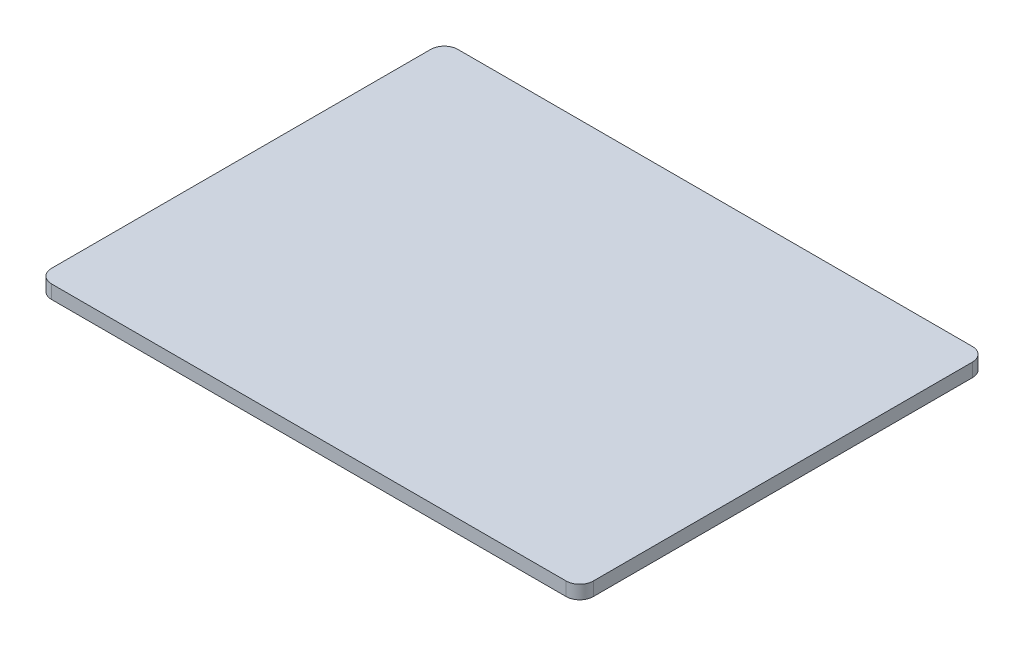
ISO-10303-21;
HEADER;
FILE_DESCRIPTION(('STEP AP214'),'2;1');
FILE_NAME('part.step','',(''),(''),'','','');
FILE_SCHEMA(('AUTOMOTIVE_DESIGN { 1 0 10303 214 1 1 1 1 }'));
ENDSEC;
DATA;
#1=APPLICATION_CONTEXT('core data for automotive mechanical design processes');
#2=APPLICATION_PROTOCOL_DEFINITION('international standard','automotive_design',2000,#1);
#3=PRODUCT_CONTEXT('',#1,'mechanical');
#4=PRODUCT('Part','Part','',(#3));
#5=PRODUCT_RELATED_PRODUCT_CATEGORY('part','',(#4));
#6=PRODUCT_DEFINITION_FORMATION('','',#4);
#7=PRODUCT_DEFINITION_CONTEXT('part definition',#1,'design');
#8=PRODUCT_DEFINITION('design','',#6,#7);
#9=PRODUCT_DEFINITION_SHAPE('','',#8);
#10=(LENGTH_UNIT() NAMED_UNIT(*) SI_UNIT(.MILLI.,.METRE.));
#11=(NAMED_UNIT(*) PLANE_ANGLE_UNIT() SI_UNIT($,.RADIAN.));
#12=(NAMED_UNIT(*) SI_UNIT($,.STERADIAN.) SOLID_ANGLE_UNIT());
#13=UNCERTAINTY_MEASURE_WITH_UNIT(LENGTH_MEASURE(1.E-05),#10,'distance_accuracy_value','');
#14=(GEOMETRIC_REPRESENTATION_CONTEXT(3) GLOBAL_UNCERTAINTY_ASSIGNED_CONTEXT((#13)) GLOBAL_UNIT_ASSIGNED_CONTEXT((#10,
#11,#12)) REPRESENTATION_CONTEXT('',''));
#15=CARTESIAN_POINT('',(0.,0.,0.));
#16=DIRECTION('',(0.,0.,1.));
#17=DIRECTION('',(1.,0.,0.));
#18=AXIS2_PLACEMENT_3D('',#15,#16,#17);
#19=CARTESIAN_POINT('',(0.,10.,0.));
#20=DIRECTION('',(1.,0.,0.));
#21=DIRECTION('',(0.,0.,-1.));
#22=AXIS2_PLACEMENT_3D('',#19,#20,#21);
#23=PLANE('',#22);
#24=DIRECTION('',(0.,0.,1.));
#25=VECTOR('',#24,1.);
#26=CARTESIAN_POINT('',(0.,10.,0.));
#27=LINE('',#26,#25);
#28=CARTESIAN_POINT('',(0.,10.,-290.));
#29=VERTEX_POINT('',#28);
#30=CARTESIAN_POINT('',(0.,10.,-10.));
#31=VERTEX_POINT('',#30);
#32=EDGE_CURVE('E123',#29,#31,#27,.T.);
#33=ORIENTED_EDGE('',*,*,#32,.F.);
#34=DIRECTION('',(0.,-1.,0.));
#35=VECTOR('',#34,1.);
#36=CARTESIAN_POINT('',(0.,10.,-290.));
#37=LINE('',#36,#35);
#38=CARTESIAN_POINT('',(0.,0.,-290.));
#39=VERTEX_POINT('',#38);
#40=EDGE_CURVE('E108',#29,#39,#37,.T.);
#41=ORIENTED_EDGE('',*,*,#40,.T.);
#42=DIRECTION('',(0.,0.,1.));
#43=VECTOR('',#42,1.);
#44=CARTESIAN_POINT('',(0.,0.,0.));
#45=LINE('',#44,#43);
#46=CARTESIAN_POINT('',(0.,0.,-10.));
#47=VERTEX_POINT('',#46);
#48=EDGE_CURVE('E120',#39,#47,#45,.T.);
#49=ORIENTED_EDGE('',*,*,#48,.T.);
#50=DIRECTION('',(0.,-1.,0.));
#51=VECTOR('',#50,1.);
#52=CARTESIAN_POINT('',(0.,10.,-10.));
#53=LINE('',#52,#51);
#54=EDGE_CURVE('E125',#47,#31,#53,.F.);
#55=ORIENTED_EDGE('',*,*,#54,.T.);
#56=EDGE_LOOP('',(#33,#41,#49,#55));
#57=FACE_BOUND('',#56,.T.);
#58=ADVANCED_FACE('F37',(#57),#23,.F.);
#59=CARTESIAN_POINT('',(0.,10.,0.));
#60=DIRECTION('',(0.,0.,-1.));
#61=DIRECTION('',(-1.,0.,0.));
#62=AXIS2_PLACEMENT_3D('',#59,#60,#61);
#63=PLANE('',#62);
#64=DIRECTION('',(1.,0.,0.));
#65=VECTOR('',#64,1.);
#66=CARTESIAN_POINT('',(0.,10.,0.));
#67=LINE('',#66,#65);
#68=CARTESIAN_POINT('',(10.,10.,0.));
#69=VERTEX_POINT('',#68);
#70=CARTESIAN_POINT('',(390.,10.,0.));
#71=VERTEX_POINT('',#70);
#72=EDGE_CURVE('E163',#69,#71,#67,.T.);
#73=ORIENTED_EDGE('',*,*,#72,.F.);
#74=DIRECTION('',(0.,-1.,0.));
#75=VECTOR('',#74,1.);
#76=CARTESIAN_POINT('',(10.,10.,0.));
#77=LINE('',#76,#75);
#78=CARTESIAN_POINT('',(10.,0.,0.));
#79=VERTEX_POINT('',#78);
#80=EDGE_CURVE('E11',#69,#79,#77,.T.);
#81=ORIENTED_EDGE('',*,*,#80,.T.);
#82=DIRECTION('',(1.,0.,0.));
#83=VECTOR('',#82,1.);
#84=CARTESIAN_POINT('',(0.,0.,0.));
#85=LINE('',#84,#83);
#86=CARTESIAN_POINT('',(390.,0.,0.));
#87=VERTEX_POINT('',#86);
#88=EDGE_CURVE('E130',#79,#87,#85,.T.);
#89=ORIENTED_EDGE('',*,*,#88,.T.);
#90=DIRECTION('',(0.,-1.,0.));
#91=VECTOR('',#90,1.);
#92=CARTESIAN_POINT('',(390.,10.,0.));
#93=LINE('',#92,#91);
#94=EDGE_CURVE('E45',#87,#71,#93,.F.);
#95=ORIENTED_EDGE('',*,*,#94,.T.);
#96=EDGE_LOOP('',(#73,#81,#89,#95));
#97=FACE_BOUND('',#96,.T.);
#98=ADVANCED_FACE('F162',(#97),#63,.F.);
#99=CARTESIAN_POINT('',(400.,10.,0.));
#100=DIRECTION('',(-1.,0.,0.));
#101=DIRECTION('',(0.,0.,1.));
#102=AXIS2_PLACEMENT_3D('',#99,#100,#101);
#103=PLANE('',#102);
#104=DIRECTION('',(0.,0.,-1.));
#105=VECTOR('',#104,1.);
#106=CARTESIAN_POINT('',(400.,0.,0.));
#107=LINE('',#106,#105);
#108=CARTESIAN_POINT('',(400.,0.,-10.));
#109=VERTEX_POINT('',#108);
#110=CARTESIAN_POINT('',(400.,0.,-290.));
#111=VERTEX_POINT('',#110);
#112=EDGE_CURVE('E133',#109,#111,#107,.T.);
#113=ORIENTED_EDGE('',*,*,#112,.T.);
#114=DIRECTION('',(0.,-1.,0.));
#115=VECTOR('',#114,1.);
#116=CARTESIAN_POINT('',(400.,10.,-290.));
#117=LINE('',#116,#115);
#118=CARTESIAN_POINT('',(400.,10.,-290.));
#119=VERTEX_POINT('',#118);
#120=EDGE_CURVE('E52',#111,#119,#117,.F.);
#121=ORIENTED_EDGE('',*,*,#120,.T.);
#122=DIRECTION('',(0.,0.,-1.));
#123=VECTOR('',#122,1.);
#124=CARTESIAN_POINT('',(400.,10.,0.));
#125=LINE('',#124,#123);
#126=CARTESIAN_POINT('',(400.,10.,-10.));
#127=VERTEX_POINT('',#126);
#128=EDGE_CURVE('E169',#127,#119,#125,.T.);
#129=ORIENTED_EDGE('',*,*,#128,.F.);
#130=DIRECTION('',(0.,-1.,0.));
#131=VECTOR('',#130,1.);
#132=CARTESIAN_POINT('',(400.,10.,-10.));
#133=LINE('',#132,#131);
#134=EDGE_CURVE('E156',#127,#109,#133,.T.);
#135=ORIENTED_EDGE('',*,*,#134,.T.);
#136=EDGE_LOOP('',(#113,#121,#129,#135));
#137=FACE_BOUND('',#136,.T.);
#138=ADVANCED_FACE('F173',(#137),#103,.F.);
#139=CARTESIAN_POINT('',(0.,10.,-300.));
#140=DIRECTION('',(0.,0.,1.));
#141=DIRECTION('',(1.,0.,0.));
#142=AXIS2_PLACEMENT_3D('',#139,#140,#141);
#143=PLANE('',#142);
#144=DIRECTION('',(-1.,0.,0.));
#145=VECTOR('',#144,1.);
#146=CARTESIAN_POINT('',(0.,0.,-300.));
#147=LINE('',#146,#145);
#148=CARTESIAN_POINT('',(390.,0.,-300.));
#149=VERTEX_POINT('',#148);
#150=CARTESIAN_POINT('',(10.,0.,-300.));
#151=VERTEX_POINT('',#150);
#152=EDGE_CURVE('E140',#149,#151,#147,.T.);
#153=ORIENTED_EDGE('',*,*,#152,.T.);
#154=DIRECTION('',(0.,-1.,0.));
#155=VECTOR('',#154,1.);
#156=CARTESIAN_POINT('',(10.,10.,-300.));
#157=LINE('',#156,#155);
#158=CARTESIAN_POINT('',(10.,10.,-300.));
#159=VERTEX_POINT('',#158);
#160=EDGE_CURVE('E109',#151,#159,#157,.F.);
#161=ORIENTED_EDGE('',*,*,#160,.T.);
#162=DIRECTION('',(-1.,0.,0.));
#163=VECTOR('',#162,1.);
#164=CARTESIAN_POINT('',(0.,10.,-300.));
#165=LINE('',#164,#163);
#166=CARTESIAN_POINT('',(390.,10.,-300.));
#167=VERTEX_POINT('',#166);
#168=EDGE_CURVE('E136',#167,#159,#165,.T.);
#169=ORIENTED_EDGE('',*,*,#168,.F.);
#170=DIRECTION('',(0.,-1.,0.));
#171=VECTOR('',#170,1.);
#172=CARTESIAN_POINT('',(390.,10.,-300.));
#173=LINE('',#172,#171);
#174=EDGE_CURVE('E114',#167,#149,#173,.T.);
#175=ORIENTED_EDGE('',*,*,#174,.T.);
#176=EDGE_LOOP('',(#153,#161,#169,#175));
#177=FACE_BOUND('',#176,.T.);
#178=ADVANCED_FACE('F180',(#177),#143,.F.);
#179=CARTESIAN_POINT('',(0.,10.,0.));
#180=DIRECTION('',(0.,-1.,0.));
#181=DIRECTION('',(0.,0.,-1.));
#182=AXIS2_PLACEMENT_3D('',#179,#180,#181);
#183=PLANE('',#182);
#184=ORIENTED_EDGE('',*,*,#168,.T.);
#185=CARTESIAN_POINT('',(10.,10.,-290.));
#186=DIRECTION('',(0.,-1.,0.));
#187=DIRECTION('',(0.,0.,-1.));
#188=AXIS2_PLACEMENT_3D('',#185,#186,#187);
#189=CIRCLE('',#188,10.);
#190=EDGE_CURVE('E154',#159,#29,#189,.F.);
#191=ORIENTED_EDGE('',*,*,#190,.T.);
#192=ORIENTED_EDGE('',*,*,#32,.T.);
#193=CARTESIAN_POINT('',(10.,10.,-10.));
#194=DIRECTION('',(0.,-1.,0.));
#195=DIRECTION('',(0.,0.,-1.));
#196=AXIS2_PLACEMENT_3D('',#193,#194,#195);
#197=CIRCLE('',#196,10.);
#198=EDGE_CURVE('E150',#31,#69,#197,.F.);
#199=ORIENTED_EDGE('',*,*,#198,.T.);
#200=ORIENTED_EDGE('',*,*,#72,.T.);
#201=CARTESIAN_POINT('',(390.,10.,-10.));
#202=DIRECTION('',(0.,-1.,0.));
#203=DIRECTION('',(0.,0.,-1.));
#204=AXIS2_PLACEMENT_3D('',#201,#202,#203);
#205=CIRCLE('',#204,10.);
#206=EDGE_CURVE('E59',#71,#127,#205,.F.);
#207=ORIENTED_EDGE('',*,*,#206,.T.);
#208=ORIENTED_EDGE('',*,*,#128,.T.);
#209=CARTESIAN_POINT('',(390.,10.,-290.));
#210=DIRECTION('',(0.,-1.,0.));
#211=DIRECTION('',(0.,0.,-1.));
#212=AXIS2_PLACEMENT_3D('',#209,#210,#211);
#213=CIRCLE('',#212,10.);
#214=EDGE_CURVE('E152',#119,#167,#213,.F.);
#215=ORIENTED_EDGE('',*,*,#214,.T.);
#216=EDGE_LOOP('',(#184,#191,#192,#199,#200,#207,#208,#215));
#217=FACE_BOUND('',#216,.T.);
#218=ADVANCED_FACE('F167',(#217),#183,.F.);
#219=CARTESIAN_POINT('',(0.,0.,0.));
#220=DIRECTION('',(0.,-1.,0.));
#221=DIRECTION('',(0.,0.,-1.));
#222=AXIS2_PLACEMENT_3D('',#219,#220,#221);
#223=PLANE('',#222);
#224=ORIENTED_EDGE('',*,*,#48,.F.);
#225=CARTESIAN_POINT('',(10.,0.,-290.));
#226=DIRECTION('',(0.,-1.,0.));
#227=DIRECTION('',(0.,0.,-1.));
#228=AXIS2_PLACEMENT_3D('',#225,#226,#227);
#229=CIRCLE('',#228,10.);
#230=EDGE_CURVE('E104',#39,#151,#229,.T.);
#231=ORIENTED_EDGE('',*,*,#230,.T.);
#232=ORIENTED_EDGE('',*,*,#152,.F.);
#233=CARTESIAN_POINT('',(390.,0.,-290.));
#234=DIRECTION('',(0.,-1.,0.));
#235=DIRECTION('',(0.,0.,-1.));
#236=AXIS2_PLACEMENT_3D('',#233,#234,#235);
#237=CIRCLE('',#236,10.);
#238=EDGE_CURVE('E115',#149,#111,#237,.T.);
#239=ORIENTED_EDGE('',*,*,#238,.T.);
#240=ORIENTED_EDGE('',*,*,#112,.F.);
#241=CARTESIAN_POINT('',(390.,0.,-10.));
#242=DIRECTION('',(0.,-1.,0.));
#243=DIRECTION('',(0.,0.,-1.));
#244=AXIS2_PLACEMENT_3D('',#241,#242,#243);
#245=CIRCLE('',#244,10.);
#246=EDGE_CURVE('E124',#109,#87,#245,.T.);
#247=ORIENTED_EDGE('',*,*,#246,.T.);
#248=ORIENTED_EDGE('',*,*,#88,.F.);
#249=CARTESIAN_POINT('',(10.,0.,-10.));
#250=DIRECTION('',(0.,-1.,0.));
#251=DIRECTION('',(0.,0.,-1.));
#252=AXIS2_PLACEMENT_3D('',#249,#250,#251);
#253=CIRCLE('',#252,10.);
#254=EDGE_CURVE('E129',#79,#47,#253,.T.);
#255=ORIENTED_EDGE('',*,*,#254,.T.);
#256=EDGE_LOOP('',(#224,#231,#232,#239,#240,#247,#248,#255));
#257=FACE_BOUND('',#256,.T.);
#258=ADVANCED_FACE('F127',(#257),#223,.T.);
#259=CARTESIAN_POINT('',(10.,10.,-290.));
#260=DIRECTION('',(0.,-1.,0.));
#261=DIRECTION('',(0.,0.,-1.));
#262=AXIS2_PLACEMENT_3D('',#259,#260,#261);
#263=CYLINDRICAL_SURFACE('',#262,10.);
#264=ORIENTED_EDGE('',*,*,#190,.F.);
#265=ORIENTED_EDGE('',*,*,#160,.F.);
#266=ORIENTED_EDGE('',*,*,#230,.F.);
#267=ORIENTED_EDGE('',*,*,#40,.F.);
#268=EDGE_LOOP('',(#264,#265,#266,#267));
#269=FACE_BOUND('',#268,.T.);
#270=ADVANCED_FACE('F107',(#269),#263,.T.);
#271=CARTESIAN_POINT('',(390.,10.,-290.));
#272=DIRECTION('',(0.,-1.,0.));
#273=DIRECTION('',(0.,0.,-1.));
#274=AXIS2_PLACEMENT_3D('',#271,#272,#273);
#275=CYLINDRICAL_SURFACE('',#274,10.);
#276=ORIENTED_EDGE('',*,*,#214,.F.);
#277=ORIENTED_EDGE('',*,*,#120,.F.);
#278=ORIENTED_EDGE('',*,*,#238,.F.);
#279=ORIENTED_EDGE('',*,*,#174,.F.);
#280=EDGE_LOOP('',(#276,#277,#278,#279));
#281=FACE_BOUND('',#280,.T.);
#282=ADVANCED_FACE('F177',(#281),#275,.T.);
#283=CARTESIAN_POINT('',(10.,10.,-10.));
#284=DIRECTION('',(0.,-1.,0.));
#285=DIRECTION('',(0.,0.,-1.));
#286=AXIS2_PLACEMENT_3D('',#283,#284,#285);
#287=CYLINDRICAL_SURFACE('',#286,10.);
#288=ORIENTED_EDGE('',*,*,#198,.F.);
#289=ORIENTED_EDGE('',*,*,#54,.F.);
#290=ORIENTED_EDGE('',*,*,#254,.F.);
#291=ORIENTED_EDGE('',*,*,#80,.F.);
#292=EDGE_LOOP('',(#288,#289,#290,#291));
#293=FACE_BOUND('',#292,.T.);
#294=ADVANCED_FACE('F183',(#293),#287,.T.);
#295=CARTESIAN_POINT('',(390.,10.,-10.));
#296=DIRECTION('',(0.,-1.,0.));
#297=DIRECTION('',(0.,0.,-1.));
#298=AXIS2_PLACEMENT_3D('',#295,#296,#297);
#299=CYLINDRICAL_SURFACE('',#298,10.);
#300=ORIENTED_EDGE('',*,*,#206,.F.);
#301=ORIENTED_EDGE('',*,*,#94,.F.);
#302=ORIENTED_EDGE('',*,*,#246,.F.);
#303=ORIENTED_EDGE('',*,*,#134,.F.);
#304=EDGE_LOOP('',(#300,#301,#302,#303));
#305=FACE_BOUND('',#304,.T.);
#306=ADVANCED_FACE('F39',(#305),#299,.T.);
#307=CLOSED_SHELL('',(#58,#98,#138,#178,#218,#258,#270,#282,#294,#306));
#308=MANIFOLD_SOLID_BREP('B2',#307);
#309=ADVANCED_BREP_SHAPE_REPRESENTATION('',(#18,#308),#14);
#310=SHAPE_DEFINITION_REPRESENTATION(#9,#309);
ENDSEC;
END-ISO-10303-21;
